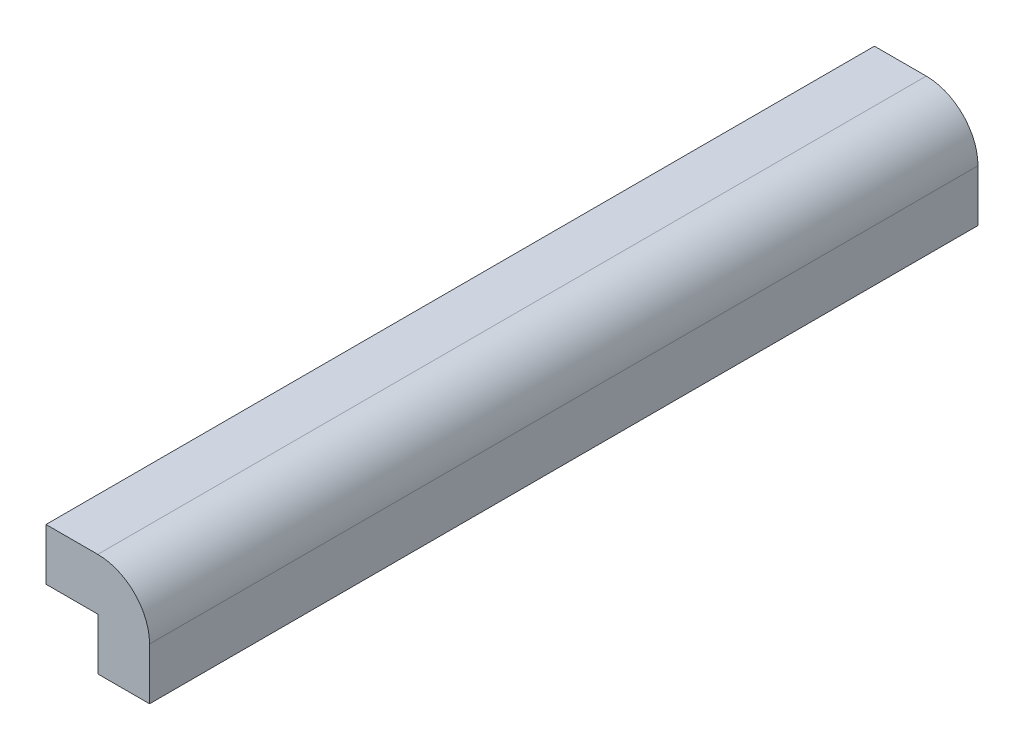
ISO-10303-21;
HEADER;
FILE_DESCRIPTION(('STEP AP214'),'2;1');
FILE_NAME('part.step','',(''),(''),'','','');
FILE_SCHEMA(('AUTOMOTIVE_DESIGN { 1 0 10303 214 1 1 1 1 }'));
ENDSEC;
DATA;
#1=APPLICATION_CONTEXT('core data for automotive mechanical design processes');
#2=APPLICATION_PROTOCOL_DEFINITION('international standard','automotive_design',2000,#1);
#3=PRODUCT_CONTEXT('',#1,'mechanical');
#4=PRODUCT('Part','Part','',(#3));
#5=PRODUCT_RELATED_PRODUCT_CATEGORY('part','',(#4));
#6=PRODUCT_DEFINITION_FORMATION('','',#4);
#7=PRODUCT_DEFINITION_CONTEXT('part definition',#1,'design');
#8=PRODUCT_DEFINITION('design','',#6,#7);
#9=PRODUCT_DEFINITION_SHAPE('','',#8);
#10=(LENGTH_UNIT() NAMED_UNIT(*) SI_UNIT(.MILLI.,.METRE.));
#11=(NAMED_UNIT(*) PLANE_ANGLE_UNIT() SI_UNIT($,.RADIAN.));
#12=(NAMED_UNIT(*) SI_UNIT($,.STERADIAN.) SOLID_ANGLE_UNIT());
#13=UNCERTAINTY_MEASURE_WITH_UNIT(LENGTH_MEASURE(1.E-05),#10,'distance_accuracy_value','');
#14=(GEOMETRIC_REPRESENTATION_CONTEXT(3) GLOBAL_UNCERTAINTY_ASSIGNED_CONTEXT((#13)) GLOBAL_UNIT_ASSIGNED_CONTEXT((#10,
#11,#12)) REPRESENTATION_CONTEXT('',''));
#15=CARTESIAN_POINT('',(0.,0.,0.));
#16=DIRECTION('',(0.,0.,1.));
#17=DIRECTION('',(1.,0.,0.));
#18=AXIS2_PLACEMENT_3D('',#15,#16,#17);
#19=CARTESIAN_POINT('',(0.,0.,128.));
#20=DIRECTION('',(1.,0.,0.));
#21=DIRECTION('',(0.,1.,0.));
#22=AXIS2_PLACEMENT_3D('',#19,#20,#21);
#23=PLANE('',#22);
#24=DIRECTION('',(0.,-1.,0.));
#25=VECTOR('',#24,1.);
#26=CARTESIAN_POINT('',(0.,0.,0.));
#27=LINE('',#26,#25);
#28=CARTESIAN_POINT('',(0.,0.,0.));
#29=VERTEX_POINT('',#28);
#30=CARTESIAN_POINT('',(0.,-8.,0.));
#31=VERTEX_POINT('',#30);
#32=EDGE_CURVE('E129',#29,#31,#27,.T.);
#33=ORIENTED_EDGE('',*,*,#32,.T.);
#34=DIRECTION('',(0.,0.,-1.));
#35=VECTOR('',#34,1.);
#36=CARTESIAN_POINT('',(0.,-8.,128.));
#37=LINE('',#36,#35);
#38=CARTESIAN_POINT('',(0.,-8.,128.));
#39=VERTEX_POINT('',#38);
#40=EDGE_CURVE('E11',#39,#31,#37,.T.);
#41=ORIENTED_EDGE('',*,*,#40,.F.);
#42=DIRECTION('',(0.,-1.,0.));
#43=VECTOR('',#42,1.);
#44=CARTESIAN_POINT('',(0.,0.,128.));
#45=LINE('',#44,#43);
#46=CARTESIAN_POINT('',(0.,0.,128.));
#47=VERTEX_POINT('',#46);
#48=EDGE_CURVE('E141',#47,#39,#45,.T.);
#49=ORIENTED_EDGE('',*,*,#48,.F.);
#50=DIRECTION('',(0.,0.,-1.));
#51=VECTOR('',#50,1.);
#52=CARTESIAN_POINT('',(0.,0.,128.));
#53=LINE('',#52,#51);
#54=EDGE_CURVE('E125',#47,#29,#53,.T.);
#55=ORIENTED_EDGE('',*,*,#54,.T.);
#56=EDGE_LOOP('',(#33,#41,#49,#55));
#57=FACE_BOUND('',#56,.T.);
#58=ADVANCED_FACE('F39',(#57),#23,.F.);
#59=CARTESIAN_POINT('',(0.,-8.,128.));
#60=DIRECTION('',(0.,1.,0.));
#61=DIRECTION('',(0.,0.,1.));
#62=AXIS2_PLACEMENT_3D('',#59,#60,#61);
#63=PLANE('',#62);
#64=DIRECTION('',(1.,0.,0.));
#65=VECTOR('',#64,1.);
#66=CARTESIAN_POINT('',(0.,-8.,0.));
#67=LINE('',#66,#65);
#68=CARTESIAN_POINT('',(8.,-8.,0.));
#69=VERTEX_POINT('',#68);
#70=EDGE_CURVE('E132',#31,#69,#67,.T.);
#71=ORIENTED_EDGE('',*,*,#70,.T.);
#72=DIRECTION('',(0.,0.,-1.));
#73=VECTOR('',#72,1.);
#74=CARTESIAN_POINT('',(8.,-8.,128.));
#75=LINE('',#74,#73);
#76=CARTESIAN_POINT('',(8.,-8.,128.));
#77=VERTEX_POINT('',#76);
#78=EDGE_CURVE('E47',#77,#69,#75,.T.);
#79=ORIENTED_EDGE('',*,*,#78,.F.);
#80=DIRECTION('',(1.,0.,0.));
#81=VECTOR('',#80,1.);
#82=CARTESIAN_POINT('',(0.,-8.,128.));
#83=LINE('',#82,#81);
#84=EDGE_CURVE('E95',#39,#77,#83,.T.);
#85=ORIENTED_EDGE('',*,*,#84,.F.);
#86=ORIENTED_EDGE('',*,*,#40,.T.);
#87=EDGE_LOOP('',(#71,#79,#85,#86));
#88=FACE_BOUND('',#87,.T.);
#89=ADVANCED_FACE('F166',(#88),#63,.F.);
#90=CARTESIAN_POINT('',(8.,0.,128.));
#91=DIRECTION('',(-1.,0.,0.));
#92=DIRECTION('',(0.,-1.,0.));
#93=AXIS2_PLACEMENT_3D('',#90,#91,#92);
#94=PLANE('',#93);
#95=DIRECTION('',(0.,1.,0.));
#96=VECTOR('',#95,1.);
#97=CARTESIAN_POINT('',(8.,0.,0.));
#98=LINE('',#97,#96);
#99=CARTESIAN_POINT('',(8.,0.,0.));
#100=VERTEX_POINT('',#99);
#101=EDGE_CURVE('E134',#69,#100,#98,.T.);
#102=ORIENTED_EDGE('',*,*,#101,.T.);
#103=DIRECTION('',(0.,0.,-1.));
#104=VECTOR('',#103,1.);
#105=CARTESIAN_POINT('',(8.,0.,128.));
#106=LINE('',#105,#104);
#107=CARTESIAN_POINT('',(8.,0.,128.));
#108=VERTEX_POINT('',#107);
#109=EDGE_CURVE('E145',#108,#100,#106,.T.);
#110=ORIENTED_EDGE('',*,*,#109,.F.);
#111=DIRECTION('',(0.,1.,0.));
#112=VECTOR('',#111,1.);
#113=CARTESIAN_POINT('',(8.,0.,128.));
#114=LINE('',#113,#112);
#115=EDGE_CURVE('E153',#77,#108,#114,.T.);
#116=ORIENTED_EDGE('',*,*,#115,.F.);
#117=ORIENTED_EDGE('',*,*,#78,.T.);
#118=EDGE_LOOP('',(#102,#110,#116,#117));
#119=FACE_BOUND('',#118,.T.);
#120=ADVANCED_FACE('F151',(#119),#94,.F.);
#121=CARTESIAN_POINT('',(0.,0.,128.));
#122=DIRECTION('',(0.,0.,-1.));
#123=DIRECTION('',(-1.,0.,0.));
#124=AXIS2_PLACEMENT_3D('',#121,#122,#123);
#125=CYLINDRICAL_SURFACE('',#124,8.);
#126=CARTESIAN_POINT('',(0.,0.,0.));
#127=DIRECTION('',(0.,0.,1.));
#128=DIRECTION('',(-1.,0.,0.));
#129=AXIS2_PLACEMENT_3D('',#126,#127,#128);
#130=CIRCLE('',#129,8.);
#131=CARTESIAN_POINT('',(0.,8.,0.));
#132=VERTEX_POINT('',#131);
#133=EDGE_CURVE('E136',#100,#132,#130,.T.);
#134=ORIENTED_EDGE('',*,*,#133,.T.);
#135=DIRECTION('',(0.,0.,-1.));
#136=VECTOR('',#135,1.);
#137=CARTESIAN_POINT('',(0.,8.,128.));
#138=LINE('',#137,#136);
#139=CARTESIAN_POINT('',(0.,8.,128.));
#140=VERTEX_POINT('',#139);
#141=EDGE_CURVE('E120',#140,#132,#138,.T.);
#142=ORIENTED_EDGE('',*,*,#141,.F.);
#143=CARTESIAN_POINT('',(0.,0.,128.));
#144=DIRECTION('',(0.,0.,1.));
#145=DIRECTION('',(-1.,0.,0.));
#146=AXIS2_PLACEMENT_3D('',#143,#144,#145);
#147=CIRCLE('',#146,8.);
#148=EDGE_CURVE('E111',#108,#140,#147,.T.);
#149=ORIENTED_EDGE('',*,*,#148,.F.);
#150=ORIENTED_EDGE('',*,*,#109,.T.);
#151=EDGE_LOOP('',(#134,#142,#149,#150));
#152=FACE_BOUND('',#151,.T.);
#153=ADVANCED_FACE('F159',(#152),#125,.T.);
#154=CARTESIAN_POINT('',(0.,8.,128.));
#155=DIRECTION('',(0.,-1.,0.));
#156=DIRECTION('',(1.,0.,0.));
#157=AXIS2_PLACEMENT_3D('',#154,#155,#156);
#158=PLANE('',#157);
#159=DIRECTION('',(-1.,0.,0.));
#160=VECTOR('',#159,1.);
#161=CARTESIAN_POINT('',(0.,8.,0.));
#162=LINE('',#161,#160);
#163=CARTESIAN_POINT('',(-8.,8.,0.));
#164=VERTEX_POINT('',#163);
#165=EDGE_CURVE('E119',#132,#164,#162,.T.);
#166=ORIENTED_EDGE('',*,*,#165,.T.);
#167=DIRECTION('',(0.,0.,-1.));
#168=VECTOR('',#167,1.);
#169=CARTESIAN_POINT('',(-8.,8.,128.));
#170=LINE('',#169,#168);
#171=CARTESIAN_POINT('',(-8.,8.,128.));
#172=VERTEX_POINT('',#171);
#173=EDGE_CURVE('E116',#172,#164,#170,.T.);
#174=ORIENTED_EDGE('',*,*,#173,.F.);
#175=DIRECTION('',(-1.,0.,0.));
#176=VECTOR('',#175,1.);
#177=CARTESIAN_POINT('',(0.,8.,128.));
#178=LINE('',#177,#176);
#179=EDGE_CURVE('E105',#140,#172,#178,.T.);
#180=ORIENTED_EDGE('',*,*,#179,.F.);
#181=ORIENTED_EDGE('',*,*,#141,.T.);
#182=EDGE_LOOP('',(#166,#174,#180,#181));
#183=FACE_BOUND('',#182,.T.);
#184=ADVANCED_FACE('F117',(#183),#158,.F.);
#185=CARTESIAN_POINT('',(-8.,0.,128.));
#186=DIRECTION('',(1.,0.,0.));
#187=DIRECTION('',(0.,0.,-1.));
#188=AXIS2_PLACEMENT_3D('',#185,#186,#187);
#189=PLANE('',#188);
#190=DIRECTION('',(0.,-1.,0.));
#191=VECTOR('',#190,1.);
#192=CARTESIAN_POINT('',(-8.,0.,0.));
#193=LINE('',#192,#191);
#194=CARTESIAN_POINT('',(-8.,0.,0.));
#195=VERTEX_POINT('',#194);
#196=EDGE_CURVE('E81',#164,#195,#193,.T.);
#197=ORIENTED_EDGE('',*,*,#196,.T.);
#198=DIRECTION('',(0.,0.,-1.));
#199=VECTOR('',#198,1.);
#200=CARTESIAN_POINT('',(-8.,0.,128.));
#201=LINE('',#200,#199);
#202=CARTESIAN_POINT('',(-8.,0.,128.));
#203=VERTEX_POINT('',#202);
#204=EDGE_CURVE('E121',#203,#195,#201,.T.);
#205=ORIENTED_EDGE('',*,*,#204,.F.);
#206=DIRECTION('',(0.,-1.,0.));
#207=VECTOR('',#206,1.);
#208=CARTESIAN_POINT('',(-8.,0.,128.));
#209=LINE('',#208,#207);
#210=EDGE_CURVE('E109',#172,#203,#209,.T.);
#211=ORIENTED_EDGE('',*,*,#210,.F.);
#212=ORIENTED_EDGE('',*,*,#173,.T.);
#213=EDGE_LOOP('',(#197,#205,#211,#212));
#214=FACE_BOUND('',#213,.T.);
#215=ADVANCED_FACE('F123',(#214),#189,.F.);
#216=CARTESIAN_POINT('',(0.,0.,128.));
#217=DIRECTION('',(0.,1.,0.));
#218=DIRECTION('',(0.,0.,1.));
#219=AXIS2_PLACEMENT_3D('',#216,#217,#218);
#220=PLANE('',#219);
#221=DIRECTION('',(1.,0.,0.));
#222=VECTOR('',#221,1.);
#223=CARTESIAN_POINT('',(0.,0.,0.));
#224=LINE('',#223,#222);
#225=EDGE_CURVE('E87',#195,#29,#224,.T.);
#226=ORIENTED_EDGE('',*,*,#225,.T.);
#227=ORIENTED_EDGE('',*,*,#54,.F.);
#228=DIRECTION('',(1.,0.,0.));
#229=VECTOR('',#228,1.);
#230=CARTESIAN_POINT('',(0.,0.,128.));
#231=LINE('',#230,#229);
#232=EDGE_CURVE('E55',#203,#47,#231,.T.);
#233=ORIENTED_EDGE('',*,*,#232,.F.);
#234=ORIENTED_EDGE('',*,*,#204,.T.);
#235=EDGE_LOOP('',(#226,#227,#233,#234));
#236=FACE_BOUND('',#235,.T.);
#237=ADVANCED_FACE('F180',(#236),#220,.F.);
#238=CARTESIAN_POINT('',(0.,0.,128.));
#239=DIRECTION('',(0.,0.,-1.));
#240=DIRECTION('',(-1.,0.,0.));
#241=AXIS2_PLACEMENT_3D('',#238,#239,#240);
#242=PLANE('',#241);
#243=ORIENTED_EDGE('',*,*,#48,.T.);
#244=ORIENTED_EDGE('',*,*,#84,.T.);
#245=ORIENTED_EDGE('',*,*,#115,.T.);
#246=ORIENTED_EDGE('',*,*,#148,.T.);
#247=ORIENTED_EDGE('',*,*,#179,.T.);
#248=ORIENTED_EDGE('',*,*,#210,.T.);
#249=ORIENTED_EDGE('',*,*,#232,.T.);
#250=EDGE_LOOP('',(#243,#244,#245,#246,#247,#248,#249));
#251=FACE_BOUND('',#250,.T.);
#252=ADVANCED_FACE('F107',(#251),#242,.F.);
#253=CARTESIAN_POINT('',(0.,0.,0.));
#254=DIRECTION('',(0.,0.,-1.));
#255=DIRECTION('',(-1.,0.,0.));
#256=AXIS2_PLACEMENT_3D('',#253,#254,#255);
#257=PLANE('',#256);
#258=ORIENTED_EDGE('',*,*,#32,.F.);
#259=ORIENTED_EDGE('',*,*,#225,.F.);
#260=ORIENTED_EDGE('',*,*,#196,.F.);
#261=ORIENTED_EDGE('',*,*,#165,.F.);
#262=ORIENTED_EDGE('',*,*,#133,.F.);
#263=ORIENTED_EDGE('',*,*,#101,.F.);
#264=ORIENTED_EDGE('',*,*,#70,.F.);
#265=EDGE_LOOP('',(#258,#259,#260,#261,#262,#263,#264));
#266=FACE_BOUND('',#265,.T.);
#267=ADVANCED_FACE('F157',(#266),#257,.T.);
#268=CLOSED_SHELL('',(#58,#89,#120,#153,#184,#215,#237,#252,#267));
#269=MANIFOLD_SOLID_BREP('B2',#268);
#270=ADVANCED_BREP_SHAPE_REPRESENTATION('',(#18,#269),#14);
#271=SHAPE_DEFINITION_REPRESENTATION(#9,#270);
ENDSEC;
END-ISO-10303-21;
